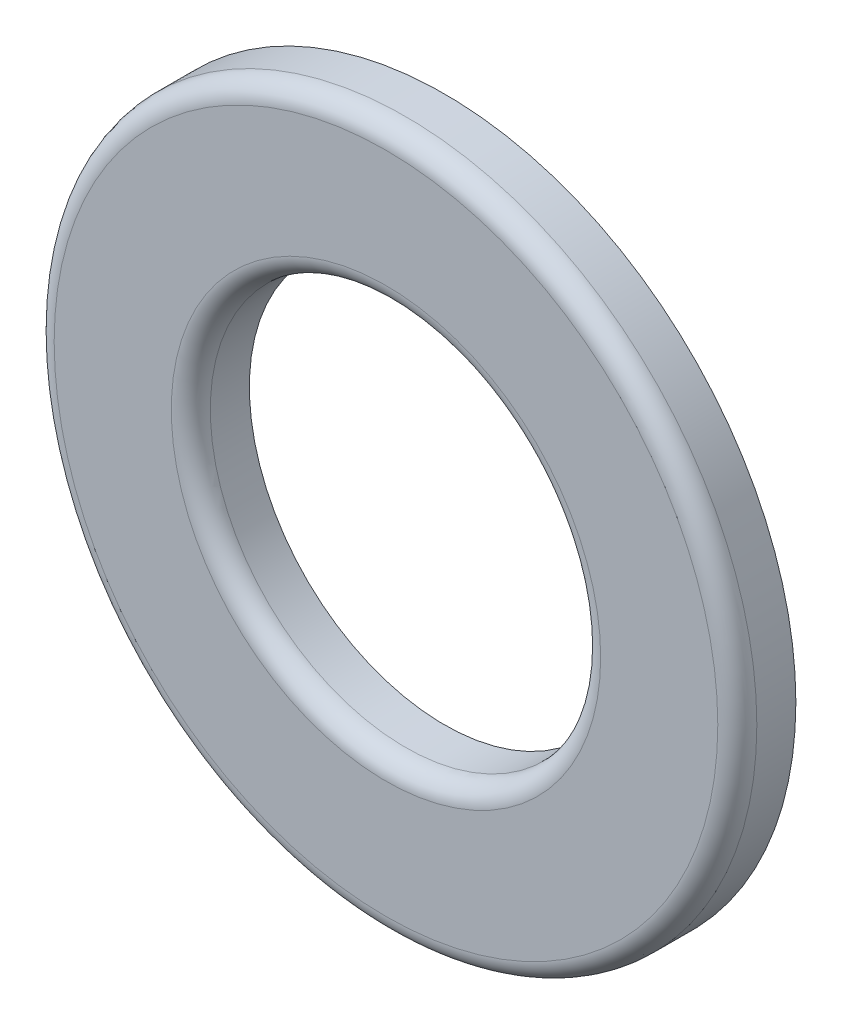
ISO-10303-21;
HEADER;
FILE_DESCRIPTION(('STEP AP214'),'2;1');
FILE_NAME('part.step','',(''),(''),'','','');
FILE_SCHEMA(('AUTOMOTIVE_DESIGN { 1 0 10303 214 1 1 1 1 }'));
ENDSEC;
DATA;
#1=APPLICATION_CONTEXT('core data for automotive mechanical design processes');
#2=APPLICATION_PROTOCOL_DEFINITION('international standard','automotive_design',2000,#1);
#3=PRODUCT_CONTEXT('',#1,'mechanical');
#4=PRODUCT('Part','Part','',(#3));
#5=PRODUCT_RELATED_PRODUCT_CATEGORY('part','',(#4));
#6=PRODUCT_DEFINITION_FORMATION('','',#4);
#7=PRODUCT_DEFINITION_CONTEXT('part definition',#1,'design');
#8=PRODUCT_DEFINITION('design','',#6,#7);
#9=PRODUCT_DEFINITION_SHAPE('','',#8);
#10=(LENGTH_UNIT() NAMED_UNIT(*) SI_UNIT(.MILLI.,.METRE.));
#11=(NAMED_UNIT(*) PLANE_ANGLE_UNIT() SI_UNIT($,.RADIAN.));
#12=(NAMED_UNIT(*) SI_UNIT($,.STERADIAN.) SOLID_ANGLE_UNIT());
#13=UNCERTAINTY_MEASURE_WITH_UNIT(LENGTH_MEASURE(1.E-05),#10,'distance_accuracy_value','');
#14=(GEOMETRIC_REPRESENTATION_CONTEXT(3) GLOBAL_UNCERTAINTY_ASSIGNED_CONTEXT((#13)) GLOBAL_UNIT_ASSIGNED_CONTEXT((#10,
#11,#12)) REPRESENTATION_CONTEXT('',''));
#15=CARTESIAN_POINT('',(0.,0.,0.));
#16=DIRECTION('',(0.,0.,1.));
#17=DIRECTION('',(1.,0.,0.));
#18=AXIS2_PLACEMENT_3D('',#15,#16,#17);
#19=CARTESIAN_POINT('',(0.,0.,0.75));
#20=DIRECTION('',(0.,0.,1.));
#21=DIRECTION('',(1.,0.,0.));
#22=AXIS2_PLACEMENT_3D('',#19,#20,#21);
#23=PLANE('',#22);
#24=CARTESIAN_POINT('',(0.,0.,0.75));
#25=DIRECTION('',(0.,0.,1.));
#26=DIRECTION('',(1.,0.,0.));
#27=AXIS2_PLACEMENT_3D('',#24,#25,#26);
#28=CIRCLE('',#27,2.75);
#29=CARTESIAN_POINT('',(2.75,0.,0.75));
#30=VERTEX_POINT('',#29);
#31=EDGE_CURVE('E39',#30,#30,#28,.F.);
#32=ORIENTED_EDGE('',*,*,#31,.T.);
#33=EDGE_LOOP('',(#32));
#34=FACE_BOUND('',#33,.T.);
#35=CARTESIAN_POINT('',(0.,0.,0.75));
#36=DIRECTION('',(0.,0.,1.));
#37=DIRECTION('',(1.,0.,0.));
#38=AXIS2_PLACEMENT_3D('',#35,#36,#37);
#39=CIRCLE('',#38,4.25);
#40=CARTESIAN_POINT('',(4.25,0.,0.75));
#41=VERTEX_POINT('',#40);
#42=EDGE_CURVE('E43',#41,#41,#39,.T.);
#43=ORIENTED_EDGE('',*,*,#42,.T.);
#44=EDGE_LOOP('',(#43));
#45=FACE_BOUND('',#44,.T.);
#46=ADVANCED_FACE('F32',(#34,#45),#23,.T.);
#47=CARTESIAN_POINT('',(0.,0.,0.));
#48=DIRECTION('',(0.,0.,1.));
#49=DIRECTION('',(1.,0.,0.));
#50=AXIS2_PLACEMENT_3D('',#47,#48,#49);
#51=PLANE('',#50);
#52=CARTESIAN_POINT('',(0.,0.,0.));
#53=DIRECTION('',(0.,0.,1.));
#54=DIRECTION('',(1.,0.,0.));
#55=AXIS2_PLACEMENT_3D('',#52,#53,#54);
#56=CIRCLE('',#55,4.5);
#57=CARTESIAN_POINT('',(4.5,0.,0.));
#58=VERTEX_POINT('',#57);
#59=EDGE_CURVE('E52',#58,#58,#56,.T.);
#60=ORIENTED_EDGE('',*,*,#59,.F.);
#61=EDGE_LOOP('',(#60));
#62=FACE_BOUND('',#61,.T.);
#63=CARTESIAN_POINT('',(0.,0.,0.));
#64=DIRECTION('',(0.,0.,1.));
#65=DIRECTION('',(1.,0.,0.));
#66=AXIS2_PLACEMENT_3D('',#63,#64,#65);
#67=CIRCLE('',#66,2.5);
#68=CARTESIAN_POINT('',(2.5,0.,0.));
#69=VERTEX_POINT('',#68);
#70=EDGE_CURVE('E55',#69,#69,#67,.T.);
#71=ORIENTED_EDGE('',*,*,#70,.T.);
#72=EDGE_LOOP('',(#71));
#73=FACE_BOUND('',#72,.T.);
#74=ADVANCED_FACE('F59',(#62,#73),#51,.F.);
#75=CARTESIAN_POINT('',(0.,0.,0.75));
#76=DIRECTION('',(0.,0.,-1.));
#77=DIRECTION('',(-1.,0.,0.));
#78=AXIS2_PLACEMENT_3D('',#75,#76,#77);
#79=CYLINDRICAL_SURFACE('',#78,4.5);
#80=CARTESIAN_POINT('',(0.,0.,0.5));
#81=DIRECTION('',(0.,0.,1.));
#82=DIRECTION('',(1.,0.,0.));
#83=AXIS2_PLACEMENT_3D('',#80,#81,#82);
#84=CIRCLE('',#83,4.5);
#85=CARTESIAN_POINT('',(4.5,0.,0.5));
#86=VERTEX_POINT('',#85);
#87=EDGE_CURVE('E10',#86,#86,#84,.F.);
#88=ORIENTED_EDGE('',*,*,#87,.T.);
#89=EDGE_LOOP('',(#88));
#90=FACE_BOUND('',#89,.T.);
#91=ORIENTED_EDGE('',*,*,#59,.T.);
#92=EDGE_LOOP('',(#91));
#93=FACE_BOUND('',#92,.T.);
#94=ADVANCED_FACE('F64',(#90,#93),#79,.T.);
#95=CARTESIAN_POINT('',(0.,0.,0.75));
#96=DIRECTION('',(0.,0.,-1.));
#97=DIRECTION('',(-1.,0.,0.));
#98=AXIS2_PLACEMENT_3D('',#95,#96,#97);
#99=CYLINDRICAL_SURFACE('',#98,2.5);
#100=CARTESIAN_POINT('',(0.,0.,0.5));
#101=DIRECTION('',(0.,0.,1.));
#102=DIRECTION('',(1.,0.,0.));
#103=AXIS2_PLACEMENT_3D('',#100,#101,#102);
#104=CIRCLE('',#103,2.5);
#105=CARTESIAN_POINT('',(2.5,0.,0.5));
#106=VERTEX_POINT('',#105);
#107=EDGE_CURVE('E47',#106,#106,#104,.T.);
#108=ORIENTED_EDGE('',*,*,#107,.T.);
#109=EDGE_LOOP('',(#108));
#110=FACE_BOUND('',#109,.T.);
#111=ORIENTED_EDGE('',*,*,#70,.F.);
#112=EDGE_LOOP('',(#111));
#113=FACE_BOUND('',#112,.T.);
#114=ADVANCED_FACE('F61',(#110,#113),#99,.F.);
#115=CARTESIAN_POINT('',(0.,0.,0.5));
#116=DIRECTION('',(0.,0.,1.));
#117=DIRECTION('',(1.,0.,0.));
#118=AXIS2_PLACEMENT_3D('',#115,#116,#117);
#119=TOROIDAL_SURFACE('',#118,2.75,0.25);
#120=ORIENTED_EDGE('',*,*,#31,.F.);
#121=EDGE_LOOP('',(#120));
#122=FACE_BOUND('',#121,.T.);
#123=ORIENTED_EDGE('',*,*,#107,.F.);
#124=EDGE_LOOP('',(#123));
#125=FACE_BOUND('',#124,.T.);
#126=ADVANCED_FACE('F63',(#122,#125),#119,.T.);
#127=CARTESIAN_POINT('',(0.,0.,0.5));
#128=DIRECTION('',(0.,0.,1.));
#129=DIRECTION('',(1.,0.,0.));
#130=AXIS2_PLACEMENT_3D('',#127,#128,#129);
#131=TOROIDAL_SURFACE('',#130,4.25,0.25);
#132=ORIENTED_EDGE('',*,*,#87,.F.);
#133=EDGE_LOOP('',(#132));
#134=FACE_BOUND('',#133,.T.);
#135=ORIENTED_EDGE('',*,*,#42,.F.);
#136=EDGE_LOOP('',(#135));
#137=FACE_BOUND('',#136,.T.);
#138=ADVANCED_FACE('F34',(#134,#137),#131,.T.);
#139=CLOSED_SHELL('',(#46,#74,#94,#114,#126,#138));
#140=MANIFOLD_SOLID_BREP('B2',#139);
#141=ADVANCED_BREP_SHAPE_REPRESENTATION('',(#18,#140),#14);
#142=SHAPE_DEFINITION_REPRESENTATION(#9,#141);
ENDSEC;
END-ISO-10303-21;
